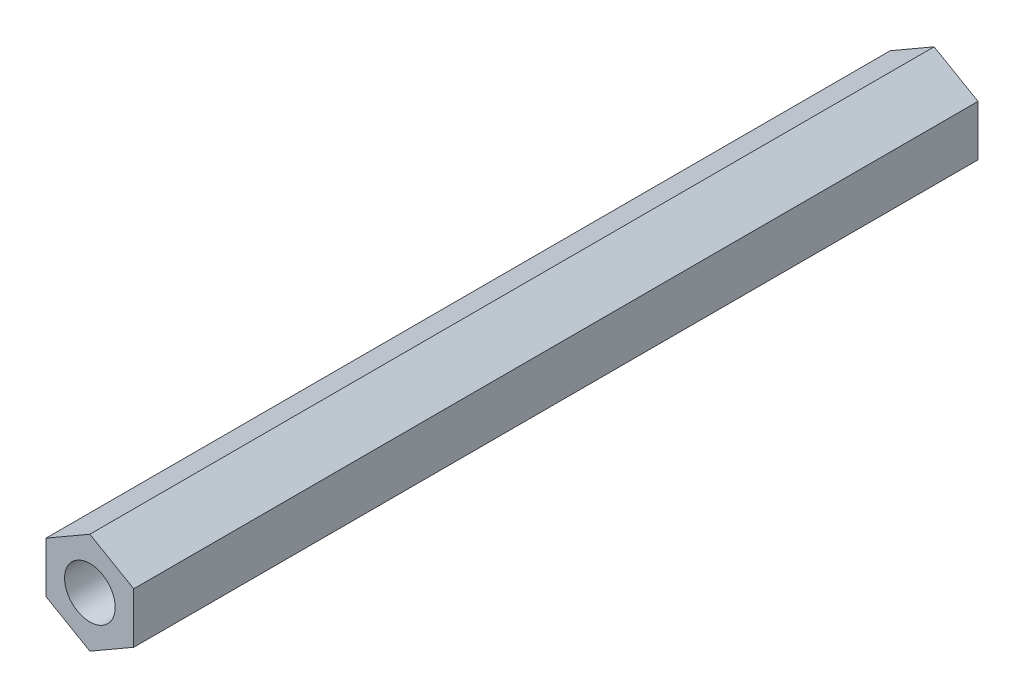
ISO-10303-21;
HEADER;
FILE_DESCRIPTION(('STEP AP214'),'2;1');
FILE_NAME('part.step','',(''),(''),'','','');
FILE_SCHEMA(('AUTOMOTIVE_DESIGN { 1 0 10303 214 1 1 1 1 }'));
ENDSEC;
DATA;
#1=APPLICATION_CONTEXT('core data for automotive mechanical design processes');
#2=APPLICATION_PROTOCOL_DEFINITION('international standard','automotive_design',2000,#1);
#3=PRODUCT_CONTEXT('',#1,'mechanical');
#4=PRODUCT('Part','Part','',(#3));
#5=PRODUCT_RELATED_PRODUCT_CATEGORY('part','',(#4));
#6=PRODUCT_DEFINITION_FORMATION('','',#4);
#7=PRODUCT_DEFINITION_CONTEXT('part definition',#1,'design');
#8=PRODUCT_DEFINITION('design','',#6,#7);
#9=PRODUCT_DEFINITION_SHAPE('','',#8);
#10=(LENGTH_UNIT() NAMED_UNIT(*) SI_UNIT(.MILLI.,.METRE.));
#11=(NAMED_UNIT(*) PLANE_ANGLE_UNIT() SI_UNIT($,.RADIAN.));
#12=(NAMED_UNIT(*) SI_UNIT($,.STERADIAN.) SOLID_ANGLE_UNIT());
#13=UNCERTAINTY_MEASURE_WITH_UNIT(LENGTH_MEASURE(1.E-05),#10,'distance_accuracy_value','');
#14=(GEOMETRIC_REPRESENTATION_CONTEXT(3) GLOBAL_UNCERTAINTY_ASSIGNED_CONTEXT((#13)) GLOBAL_UNIT_ASSIGNED_CONTEXT((#10,
#11,#12)) REPRESENTATION_CONTEXT('',''));
#15=CARTESIAN_POINT('',(0.,0.,0.));
#16=DIRECTION('',(0.,0.,1.));
#17=DIRECTION('',(1.,0.,0.));
#18=AXIS2_PLACEMENT_3D('',#15,#16,#17);
#19=CARTESIAN_POINT('',(0.,0.,50.));
#20=DIRECTION('',(0.,0.,1.));
#21=DIRECTION('',(1.,0.,0.));
#22=AXIS2_PLACEMENT_3D('',#19,#20,#21);
#23=PLANE('',#22);
#24=DIRECTION('',(0.866025403784439,-0.5,0.));
#25=VECTOR('',#24,1.);
#26=CARTESIAN_POINT('',(-15.5565698809695,65.1885565275405,50.));
#27=LINE('',#26,#25);
#28=CARTESIAN_POINT('',(-15.5565698809695,65.1885565275405,50.));
#29=VERTEX_POINT('',#28);
#30=CARTESIAN_POINT('',(-12.9584936696162,63.6885565275405,50.));
#31=VERTEX_POINT('',#30);
#32=EDGE_CURVE('E133',#29,#31,#27,.T.);
#33=ORIENTED_EDGE('',*,*,#32,.T.);
#34=DIRECTION('',(0.866025403784439,0.499999999999999,0.));
#35=VECTOR('',#34,1.);
#36=CARTESIAN_POINT('',(-12.9584936696162,63.6885565275405,50.));
#37=LINE('',#36,#35);
#38=CARTESIAN_POINT('',(-10.3604174582628,65.1885565275405,50.));
#39=VERTEX_POINT('',#38);
#40=EDGE_CURVE('E91',#31,#39,#37,.T.);
#41=ORIENTED_EDGE('',*,*,#40,.T.);
#42=DIRECTION('',(0.,1.,0.));
#43=VECTOR('',#42,1.);
#44=CARTESIAN_POINT('',(-10.3604174582628,65.1885565275405,50.));
#45=LINE('',#44,#43);
#46=CARTESIAN_POINT('',(-10.3604174582628,68.1885565275405,50.));
#47=VERTEX_POINT('',#46);
#48=EDGE_CURVE('E104',#39,#47,#45,.T.);
#49=ORIENTED_EDGE('',*,*,#48,.T.);
#50=DIRECTION('',(-0.866025403784445,0.49999999999999,0.));
#51=VECTOR('',#50,1.);
#52=CARTESIAN_POINT('',(-10.3604174582628,68.1885565275405,50.));
#53=LINE('',#52,#51);
#54=CARTESIAN_POINT('',(-12.9584936696162,69.6885565275404,50.));
#55=VERTEX_POINT('',#54);
#56=EDGE_CURVE('E98',#47,#55,#53,.T.);
#57=ORIENTED_EDGE('',*,*,#56,.T.);
#58=DIRECTION('',(-0.866025403784439,-0.499999999999999,0.));
#59=VECTOR('',#58,1.);
#60=CARTESIAN_POINT('',(-12.9584936696162,69.6885565275404,50.));
#61=LINE('',#60,#59);
#62=CARTESIAN_POINT('',(-15.5565698809695,68.1885565275405,50.));
#63=VERTEX_POINT('',#62);
#64=EDGE_CURVE('E102',#55,#63,#61,.T.);
#65=ORIENTED_EDGE('',*,*,#64,.T.);
#66=DIRECTION('',(0.,-1.,0.));
#67=VECTOR('',#66,1.);
#68=CARTESIAN_POINT('',(-15.5565698809695,68.1885565275405,50.));
#69=LINE('',#68,#67);
#70=EDGE_CURVE('E54',#63,#29,#69,.T.);
#71=ORIENTED_EDGE('',*,*,#70,.T.);
#72=EDGE_LOOP('',(#33,#41,#49,#57,#65,#71));
#73=FACE_BOUND('',#72,.T.);
#74=CARTESIAN_POINT('',(-12.9584936696162,66.6885565275405,50.));
#75=DIRECTION('',(0.,0.,1.));
#76=DIRECTION('',(1.,0.,0.));
#77=AXIS2_PLACEMENT_3D('',#74,#75,#76);
#78=CIRCLE('',#77,1.5);
#79=CARTESIAN_POINT('',(-11.4584936696162,66.6885565275405,50.));
#80=VERTEX_POINT('',#79);
#81=EDGE_CURVE('E126',#80,#80,#78,.T.);
#82=ORIENTED_EDGE('',*,*,#81,.F.);
#83=EDGE_LOOP('',(#82));
#84=FACE_BOUND('',#83,.T.);
#85=ADVANCED_FACE('F37',(#73,#84),#23,.T.);
#86=CARTESIAN_POINT('',(0.,0.,0.));
#87=DIRECTION('',(0.,0.,1.));
#88=DIRECTION('',(1.,0.,0.));
#89=AXIS2_PLACEMENT_3D('',#86,#87,#88);
#90=PLANE('',#89);
#91=DIRECTION('',(0.866025403784439,-0.5,0.));
#92=VECTOR('',#91,1.);
#93=CARTESIAN_POINT('',(-15.5565698809695,65.1885565275405,0.));
#94=LINE('',#93,#92);
#95=CARTESIAN_POINT('',(-15.5565698809695,65.1885565275405,0.));
#96=VERTEX_POINT('',#95);
#97=CARTESIAN_POINT('',(-12.9584936696162,63.6885565275405,0.));
#98=VERTEX_POINT('',#97);
#99=EDGE_CURVE('E122',#96,#98,#94,.T.);
#100=ORIENTED_EDGE('',*,*,#99,.F.);
#101=DIRECTION('',(0.,-1.,0.));
#102=VECTOR('',#101,1.);
#103=CARTESIAN_POINT('',(-15.5565698809695,68.1885565275405,0.));
#104=LINE('',#103,#102);
#105=CARTESIAN_POINT('',(-15.5565698809695,68.1885565275405,0.));
#106=VERTEX_POINT('',#105);
#107=EDGE_CURVE('E83',#106,#96,#104,.T.);
#108=ORIENTED_EDGE('',*,*,#107,.F.);
#109=DIRECTION('',(-0.866025403784439,-0.499999999999999,0.));
#110=VECTOR('',#109,1.);
#111=CARTESIAN_POINT('',(-12.9584936696162,69.6885565275404,0.));
#112=LINE('',#111,#110);
#113=CARTESIAN_POINT('',(-12.9584936696162,69.6885565275404,0.));
#114=VERTEX_POINT('',#113);
#115=EDGE_CURVE('E77',#114,#106,#112,.T.);
#116=ORIENTED_EDGE('',*,*,#115,.F.);
#117=DIRECTION('',(-0.866025403784445,0.49999999999999,0.));
#118=VECTOR('',#117,1.);
#119=CARTESIAN_POINT('',(-10.3604174582628,68.1885565275405,0.));
#120=LINE('',#119,#118);
#121=CARTESIAN_POINT('',(-10.3604174582628,68.1885565275405,0.));
#122=VERTEX_POINT('',#121);
#123=EDGE_CURVE('E112',#122,#114,#120,.T.);
#124=ORIENTED_EDGE('',*,*,#123,.F.);
#125=DIRECTION('',(0.,1.,0.));
#126=VECTOR('',#125,1.);
#127=CARTESIAN_POINT('',(-10.3604174582628,65.1885565275405,0.));
#128=LINE('',#127,#126);
#129=CARTESIAN_POINT('',(-10.3604174582628,65.1885565275405,0.));
#130=VERTEX_POINT('',#129);
#131=EDGE_CURVE('E128',#130,#122,#128,.T.);
#132=ORIENTED_EDGE('',*,*,#131,.F.);
#133=DIRECTION('',(0.866025403784439,0.499999999999999,0.));
#134=VECTOR('',#133,1.);
#135=CARTESIAN_POINT('',(-12.9584936696162,63.6885565275405,0.));
#136=LINE('',#135,#134);
#137=EDGE_CURVE('E125',#98,#130,#136,.T.);
#138=ORIENTED_EDGE('',*,*,#137,.F.);
#139=EDGE_LOOP('',(#100,#108,#116,#124,#132,#138));
#140=FACE_BOUND('',#139,.T.);
#141=CARTESIAN_POINT('',(-12.9584936696162,66.6885565275405,0.));
#142=DIRECTION('',(0.,0.,1.));
#143=DIRECTION('',(1.,0.,0.));
#144=AXIS2_PLACEMENT_3D('',#141,#142,#143);
#145=CIRCLE('',#144,1.5);
#146=CARTESIAN_POINT('',(-11.4584936696162,66.6885565275405,0.));
#147=VERTEX_POINT('',#146);
#148=EDGE_CURVE('E235',#147,#147,#145,.T.);
#149=ORIENTED_EDGE('',*,*,#148,.T.);
#150=EDGE_LOOP('',(#149));
#151=FACE_BOUND('',#150,.T.);
#152=ADVANCED_FACE('F142',(#140,#151),#90,.F.);
#153=CARTESIAN_POINT('',(-15.5565698809695,65.1885565275405,50.));
#154=DIRECTION('',(0.5,0.866025403784439,0.));
#155=DIRECTION('',(-0.866025403784439,0.5,0.));
#156=AXIS2_PLACEMENT_3D('',#153,#154,#155);
#157=PLANE('',#156);
#158=ORIENTED_EDGE('',*,*,#99,.T.);
#159=DIRECTION('',(0.,0.,-1.));
#160=VECTOR('',#159,1.);
#161=CARTESIAN_POINT('',(-12.9584936696162,63.6885565275405,50.));
#162=LINE('',#161,#160);
#163=EDGE_CURVE('E11',#31,#98,#162,.T.);
#164=ORIENTED_EDGE('',*,*,#163,.F.);
#165=ORIENTED_EDGE('',*,*,#32,.F.);
#166=DIRECTION('',(0.,0.,-1.));
#167=VECTOR('',#166,1.);
#168=CARTESIAN_POINT('',(-15.5565698809695,65.1885565275405,50.));
#169=LINE('',#168,#167);
#170=EDGE_CURVE('E118',#29,#96,#169,.T.);
#171=ORIENTED_EDGE('',*,*,#170,.T.);
#172=EDGE_LOOP('',(#158,#164,#165,#171));
#173=FACE_BOUND('',#172,.T.);
#174=ADVANCED_FACE('F39',(#173),#157,.F.);
#175=CARTESIAN_POINT('',(-12.9584936696162,63.6885565275405,50.));
#176=DIRECTION('',(-0.499999999999999,0.866025403784439,0.));
#177=DIRECTION('',(-0.866025403784439,-0.499999999999999,0.));
#178=AXIS2_PLACEMENT_3D('',#175,#176,#177);
#179=PLANE('',#178);
#180=ORIENTED_EDGE('',*,*,#137,.T.);
#181=DIRECTION('',(0.,0.,-1.));
#182=VECTOR('',#181,1.);
#183=CARTESIAN_POINT('',(-10.3604174582628,65.1885565275405,50.));
#184=LINE('',#183,#182);
#185=EDGE_CURVE('E46',#39,#130,#184,.T.);
#186=ORIENTED_EDGE('',*,*,#185,.F.);
#187=ORIENTED_EDGE('',*,*,#40,.F.);
#188=ORIENTED_EDGE('',*,*,#163,.T.);
#189=EDGE_LOOP('',(#180,#186,#187,#188));
#190=FACE_BOUND('',#189,.T.);
#191=ADVANCED_FACE('F167',(#190),#179,.F.);
#192=CARTESIAN_POINT('',(-10.3604174582628,65.1885565275405,50.));
#193=DIRECTION('',(-1.,0.,0.));
#194=DIRECTION('',(0.,0.,1.));
#195=AXIS2_PLACEMENT_3D('',#192,#193,#194);
#196=PLANE('',#195);
#197=ORIENTED_EDGE('',*,*,#131,.T.);
#198=DIRECTION('',(0.,0.,-1.));
#199=VECTOR('',#198,1.);
#200=CARTESIAN_POINT('',(-10.3604174582628,68.1885565275405,50.));
#201=LINE('',#200,#199);
#202=EDGE_CURVE('E113',#47,#122,#201,.T.);
#203=ORIENTED_EDGE('',*,*,#202,.F.);
#204=ORIENTED_EDGE('',*,*,#48,.F.);
#205=ORIENTED_EDGE('',*,*,#185,.T.);
#206=EDGE_LOOP('',(#197,#203,#204,#205));
#207=FACE_BOUND('',#206,.T.);
#208=ADVANCED_FACE('F139',(#207),#196,.F.);
#209=CARTESIAN_POINT('',(-10.3604174582628,68.1885565275405,50.));
#210=DIRECTION('',(-0.49999999999999,-0.866025403784445,0.));
#211=DIRECTION('',(0.866025403784445,-0.49999999999999,0.));
#212=AXIS2_PLACEMENT_3D('',#209,#210,#211);
#213=PLANE('',#212);
#214=ORIENTED_EDGE('',*,*,#123,.T.);
#215=DIRECTION('',(0.,0.,-1.));
#216=VECTOR('',#215,1.);
#217=CARTESIAN_POINT('',(-12.9584936696162,69.6885565275404,50.));
#218=LINE('',#217,#216);
#219=EDGE_CURVE('E109',#55,#114,#218,.T.);
#220=ORIENTED_EDGE('',*,*,#219,.F.);
#221=ORIENTED_EDGE('',*,*,#56,.F.);
#222=ORIENTED_EDGE('',*,*,#202,.T.);
#223=EDGE_LOOP('',(#214,#220,#221,#222));
#224=FACE_BOUND('',#223,.T.);
#225=ADVANCED_FACE('F110',(#224),#213,.F.);
#226=CARTESIAN_POINT('',(-12.9584936696162,69.6885565275404,50.));
#227=DIRECTION('',(0.499999999999999,-0.866025403784439,0.));
#228=DIRECTION('',(0.866025403784439,0.499999999999999,0.));
#229=AXIS2_PLACEMENT_3D('',#226,#227,#228);
#230=PLANE('',#229);
#231=ORIENTED_EDGE('',*,*,#115,.T.);
#232=DIRECTION('',(0.,0.,-1.));
#233=VECTOR('',#232,1.);
#234=CARTESIAN_POINT('',(-15.5565698809695,68.1885565275405,50.));
#235=LINE('',#234,#233);
#236=EDGE_CURVE('E114',#63,#106,#235,.T.);
#237=ORIENTED_EDGE('',*,*,#236,.F.);
#238=ORIENTED_EDGE('',*,*,#64,.F.);
#239=ORIENTED_EDGE('',*,*,#219,.T.);
#240=EDGE_LOOP('',(#231,#237,#238,#239));
#241=FACE_BOUND('',#240,.T.);
#242=ADVANCED_FACE('F116',(#241),#230,.F.);
#243=CARTESIAN_POINT('',(-15.5565698809695,68.1885565275405,50.));
#244=DIRECTION('',(1.,0.,0.));
#245=DIRECTION('',(0.,0.,-1.));
#246=AXIS2_PLACEMENT_3D('',#243,#244,#245);
#247=PLANE('',#246);
#248=ORIENTED_EDGE('',*,*,#107,.T.);
#249=ORIENTED_EDGE('',*,*,#170,.F.);
#250=ORIENTED_EDGE('',*,*,#70,.F.);
#251=ORIENTED_EDGE('',*,*,#236,.T.);
#252=EDGE_LOOP('',(#248,#249,#250,#251));
#253=FACE_BOUND('',#252,.T.);
#254=ADVANCED_FACE('F147',(#253),#247,.F.);
#255=CARTESIAN_POINT('',(-12.9584936696162,66.6885565275405,50.));
#256=DIRECTION('',(0.,0.,-1.));
#257=DIRECTION('',(-1.,0.,0.));
#258=AXIS2_PLACEMENT_3D('',#255,#256,#257);
#259=CYLINDRICAL_SURFACE('',#258,1.5);
#260=ORIENTED_EDGE('',*,*,#81,.T.);
#261=EDGE_LOOP('',(#260));
#262=FACE_BOUND('',#261,.T.);
#263=ORIENTED_EDGE('',*,*,#148,.F.);
#264=EDGE_LOOP('',(#263));
#265=FACE_BOUND('',#264,.T.);
#266=ADVANCED_FACE('F149',(#262,#265),#259,.F.);
#267=CLOSED_SHELL('',(#85,#152,#174,#191,#208,#225,#242,#254,#266));
#268=MANIFOLD_SOLID_BREP('B2',#267);
#269=ADVANCED_BREP_SHAPE_REPRESENTATION('',(#18,#268),#14);
#270=SHAPE_DEFINITION_REPRESENTATION(#9,#269);
ENDSEC;
END-ISO-10303-21;
